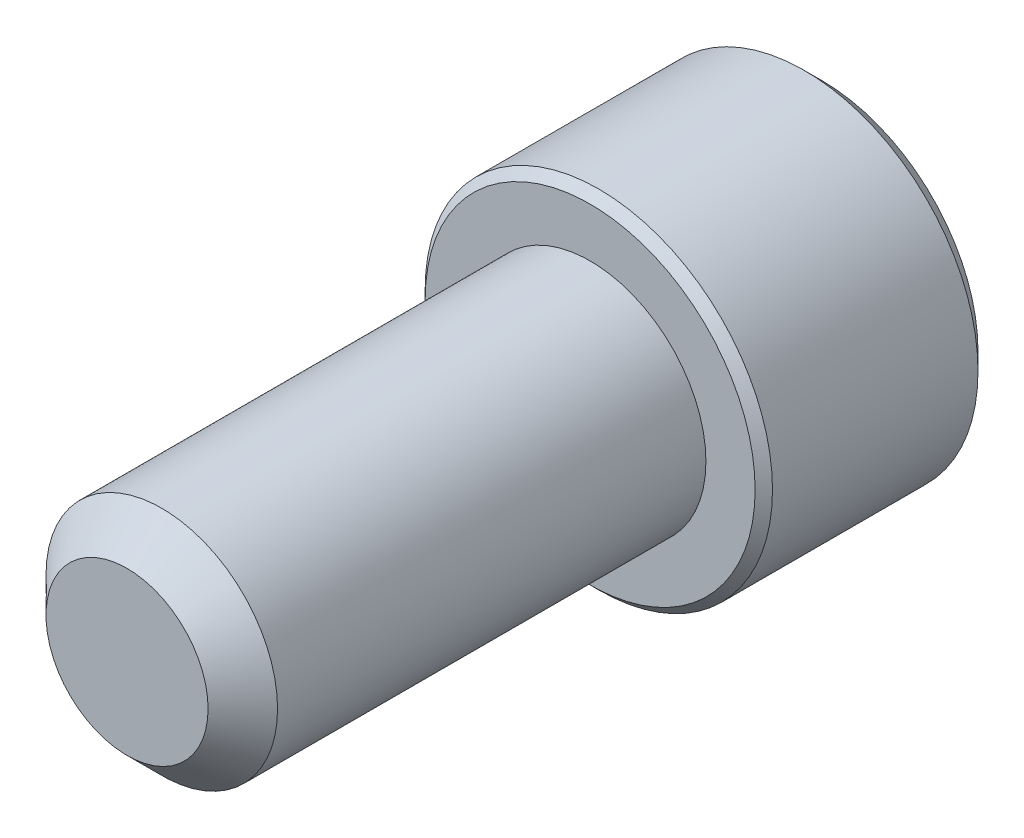
ISO-10303-21;
HEADER;
FILE_DESCRIPTION(('STEP AP214'),'2;1');
FILE_NAME('part.step','',(''),(''),'','','');
FILE_SCHEMA(('AUTOMOTIVE_DESIGN { 1 0 10303 214 1 1 1 1 }'));
ENDSEC;
DATA;
#1=APPLICATION_CONTEXT('core data for automotive mechanical design processes');
#2=APPLICATION_PROTOCOL_DEFINITION('international standard','automotive_design',2000,#1);
#3=PRODUCT_CONTEXT('',#1,'mechanical');
#4=PRODUCT('Part','Part','',(#3));
#5=PRODUCT_RELATED_PRODUCT_CATEGORY('part','',(#4));
#6=PRODUCT_DEFINITION_FORMATION('','',#4);
#7=PRODUCT_DEFINITION_CONTEXT('part definition',#1,'design');
#8=PRODUCT_DEFINITION('design','',#6,#7);
#9=PRODUCT_DEFINITION_SHAPE('','',#8);
#10=(LENGTH_UNIT() NAMED_UNIT(*) SI_UNIT(.MILLI.,.METRE.));
#11=(NAMED_UNIT(*) PLANE_ANGLE_UNIT() SI_UNIT($,.RADIAN.));
#12=(NAMED_UNIT(*) SI_UNIT($,.STERADIAN.) SOLID_ANGLE_UNIT());
#13=UNCERTAINTY_MEASURE_WITH_UNIT(LENGTH_MEASURE(1.E-05),#10,'distance_accuracy_value','');
#14=(GEOMETRIC_REPRESENTATION_CONTEXT(3) GLOBAL_UNCERTAINTY_ASSIGNED_CONTEXT((#13)) GLOBAL_UNIT_ASSIGNED_CONTEXT((#10,
#11,#12)) REPRESENTATION_CONTEXT('',''));
#15=CARTESIAN_POINT('',(0.,0.,0.));
#16=DIRECTION('',(0.,0.,1.));
#17=DIRECTION('',(1.,0.,0.));
#18=AXIS2_PLACEMENT_3D('',#15,#16,#17);
#19=CARTESIAN_POINT('',(0.,0.,-12.7));
#20=DIRECTION('',(0.,0.,1.));
#21=DIRECTION('',(1.,0.,0.));
#22=AXIS2_PLACEMENT_3D('',#19,#20,#21);
#23=CYLINDRICAL_SURFACE('',#22,3.175);
#24=CARTESIAN_POINT('',(0.,0.,-0.952500000000004));
#25=DIRECTION('',(0.,0.,1.));
#26=DIRECTION('',(1.,0.,0.));
#27=AXIS2_PLACEMENT_3D('',#24,#25,#26);
#28=CIRCLE('',#27,3.175);
#29=CARTESIAN_POINT('',(3.175,0.,-0.952500000000004));
#30=VERTEX_POINT('',#29);
#31=EDGE_CURVE('E161',#30,#30,#28,.F.);
#32=ORIENTED_EDGE('',*,*,#31,.T.);
#33=EDGE_LOOP('',(#32));
#34=FACE_BOUND('',#33,.T.);
#35=CARTESIAN_POINT('',(0.,0.,-12.7));
#36=DIRECTION('',(0.,0.,-1.));
#37=DIRECTION('',(-1.,0.,0.));
#38=AXIS2_PLACEMENT_3D('',#35,#36,#37);
#39=CIRCLE('',#38,3.175);
#40=CARTESIAN_POINT('',(-3.175,0.,-12.7));
#41=VERTEX_POINT('',#40);
#42=EDGE_CURVE('E150',#41,#41,#39,.F.);
#43=ORIENTED_EDGE('',*,*,#42,.T.);
#44=EDGE_LOOP('',(#43));
#45=FACE_BOUND('',#44,.T.);
#46=ADVANCED_FACE('F48',(#34,#45),#23,.T.);
#47=CARTESIAN_POINT('',(0.,0.,0.));
#48=DIRECTION('',(0.,0.,1.));
#49=DIRECTION('',(1.,0.,0.));
#50=AXIS2_PLACEMENT_3D('',#47,#48,#49);
#51=PLANE('',#50);
#52=CARTESIAN_POINT('',(0.,0.,0.));
#53=DIRECTION('',(0.,0.,1.));
#54=DIRECTION('',(1.,0.,0.));
#55=AXIS2_PLACEMENT_3D('',#52,#53,#54);
#56=CIRCLE('',#55,2.2225);
#57=CARTESIAN_POINT('',(2.2225,0.,0.));
#58=VERTEX_POINT('',#57);
#59=EDGE_CURVE('E158',#58,#58,#56,.T.);
#60=ORIENTED_EDGE('',*,*,#59,.T.);
#61=EDGE_LOOP('',(#60));
#62=FACE_BOUND('',#61,.T.);
#63=ADVANCED_FACE('F184',(#62),#51,.T.);
#64=CARTESIAN_POINT('',(0.,0.,0.));
#65=DIRECTION('',(0.,0.,-1.));
#66=DIRECTION('',(-1.,0.,0.));
#67=AXIS2_PLACEMENT_3D('',#64,#65,#66);
#68=CONICAL_SURFACE('',#67,2.2225,0.785398163397447);
#69=ORIENTED_EDGE('',*,*,#31,.F.);
#70=EDGE_LOOP('',(#69));
#71=FACE_BOUND('',#70,.T.);
#72=ORIENTED_EDGE('',*,*,#59,.F.);
#73=EDGE_LOOP('',(#72));
#74=FACE_BOUND('',#73,.T.);
#75=ADVANCED_FACE('F190',(#71,#74),#68,.T.);
#76=CARTESIAN_POINT('',(0.,0.,-19.05));
#77=DIRECTION('',(0.,0.,1.));
#78=DIRECTION('',(1.,0.,0.));
#79=AXIS2_PLACEMENT_3D('',#76,#77,#78);
#80=CYLINDRICAL_SURFACE('',#79,4.7625);
#81=CARTESIAN_POINT('',(0.,0.,-12.938125));
#82=DIRECTION('',(0.,0.,-1.));
#83=DIRECTION('',(-1.,0.,0.));
#84=AXIS2_PLACEMENT_3D('',#81,#82,#83);
#85=CIRCLE('',#84,4.7625);
#86=CARTESIAN_POINT('',(-4.7625,0.,-12.938125));
#87=VERTEX_POINT('',#86);
#88=EDGE_CURVE('E56',#87,#87,#85,.T.);
#89=ORIENTED_EDGE('',*,*,#88,.T.);
#90=EDGE_LOOP('',(#89));
#91=FACE_BOUND('',#90,.T.);
#92=CARTESIAN_POINT('',(0.,0.,-18.57375));
#93=DIRECTION('',(0.,0.,-1.));
#94=DIRECTION('',(-1.,0.,0.));
#95=AXIS2_PLACEMENT_3D('',#92,#93,#94);
#96=CIRCLE('',#95,4.7625);
#97=CARTESIAN_POINT('',(4.7625,0.,-18.57375));
#98=VERTEX_POINT('',#97);
#99=EDGE_CURVE('E167',#98,#98,#96,.F.);
#100=ORIENTED_EDGE('',*,*,#99,.T.);
#101=EDGE_LOOP('',(#100));
#102=FACE_BOUND('',#101,.T.);
#103=ADVANCED_FACE('F172',(#91,#102),#80,.T.);
#104=CARTESIAN_POINT('',(0.,0.,-19.05));
#105=DIRECTION('',(0.,0.,-1.));
#106=DIRECTION('',(-1.,0.,0.));
#107=AXIS2_PLACEMENT_3D('',#104,#105,#106);
#108=PLANE('',#107);
#109=CARTESIAN_POINT('',(0.,0.,-19.05));
#110=DIRECTION('',(0.,0.,-1.));
#111=DIRECTION('',(-1.,0.,0.));
#112=AXIS2_PLACEMENT_3D('',#109,#110,#111);
#113=CIRCLE('',#112,4.28625);
#114=CARTESIAN_POINT('',(4.28625,0.,-19.05));
#115=VERTEX_POINT('',#114);
#116=EDGE_CURVE('E164',#115,#115,#113,.T.);
#117=ORIENTED_EDGE('',*,*,#116,.T.);
#118=EDGE_LOOP('',(#117));
#119=FACE_BOUND('',#118,.T.);
#120=DIRECTION('',(0.866025403784439,0.5,0.));
#121=VECTOR('',#120,1.);
#122=CARTESIAN_POINT('',(-2.38125,1.3748153285078,-19.05));
#123=LINE('',#122,#121);
#124=CARTESIAN_POINT('',(-2.38125,1.3748153285078,-19.05));
#125=VERTEX_POINT('',#124);
#126=CARTESIAN_POINT('',(0.,2.74963065701559,-19.05));
#127=VERTEX_POINT('',#126);
#128=EDGE_CURVE('E63',#125,#127,#123,.T.);
#129=ORIENTED_EDGE('',*,*,#128,.F.);
#130=DIRECTION('',(0.,1.,0.));
#131=VECTOR('',#130,1.);
#132=CARTESIAN_POINT('',(-2.38125,-1.3748153285078,-19.05));
#133=LINE('',#132,#131);
#134=CARTESIAN_POINT('',(-2.38125,-1.3748153285078,-19.05));
#135=VERTEX_POINT('',#134);
#136=EDGE_CURVE('E146',#135,#125,#133,.T.);
#137=ORIENTED_EDGE('',*,*,#136,.F.);
#138=DIRECTION('',(-0.866025403784439,0.5,0.));
#139=VECTOR('',#138,1.);
#140=CARTESIAN_POINT('',(0.,-2.74963065701559,-19.05));
#141=LINE('',#140,#139);
#142=CARTESIAN_POINT('',(0.,-2.74963065701559,-19.05));
#143=VERTEX_POINT('',#142);
#144=EDGE_CURVE('E144',#143,#135,#141,.T.);
#145=ORIENTED_EDGE('',*,*,#144,.F.);
#146=DIRECTION('',(-0.866025403784439,-0.5,0.));
#147=VECTOR('',#146,1.);
#148=CARTESIAN_POINT('',(2.38125,-1.3748153285078,-19.05));
#149=LINE('',#148,#147);
#150=CARTESIAN_POINT('',(2.38125,-1.3748153285078,-19.05));
#151=VERTEX_POINT('',#150);
#152=EDGE_CURVE('E111',#151,#143,#149,.T.);
#153=ORIENTED_EDGE('',*,*,#152,.F.);
#154=DIRECTION('',(0.,-1.,0.));
#155=VECTOR('',#154,1.);
#156=CARTESIAN_POINT('',(2.38125,1.3748153285078,-19.05));
#157=LINE('',#156,#155);
#158=CARTESIAN_POINT('',(2.38125,1.3748153285078,-19.05));
#159=VERTEX_POINT('',#158);
#160=EDGE_CURVE('E140',#159,#151,#157,.T.);
#161=ORIENTED_EDGE('',*,*,#160,.F.);
#162=DIRECTION('',(0.866025403784439,-0.5,0.));
#163=VECTOR('',#162,1.);
#164=CARTESIAN_POINT('',(0.,2.74963065701559,-19.05));
#165=LINE('',#164,#163);
#166=EDGE_CURVE('E137',#127,#159,#165,.T.);
#167=ORIENTED_EDGE('',*,*,#166,.F.);
#168=EDGE_LOOP('',(#129,#137,#145,#153,#161,#167));
#169=FACE_BOUND('',#168,.T.);
#170=ADVANCED_FACE('F201',(#119,#169),#108,.T.);
#171=CARTESIAN_POINT('',(0.,0.,-12.7));
#172=DIRECTION('',(0.,0.,-1.));
#173=DIRECTION('',(-1.,0.,0.));
#174=AXIS2_PLACEMENT_3D('',#171,#172,#173);
#175=PLANE('',#174);
#176=CARTESIAN_POINT('',(0.,0.,-12.7));
#177=DIRECTION('',(0.,0.,-1.));
#178=DIRECTION('',(-1.,0.,0.));
#179=AXIS2_PLACEMENT_3D('',#176,#177,#178);
#180=CIRCLE('',#179,4.524375);
#181=CARTESIAN_POINT('',(-4.524375,0.,-12.7));
#182=VERTEX_POINT('',#181);
#183=EDGE_CURVE('E13',#182,#182,#180,.F.);
#184=ORIENTED_EDGE('',*,*,#183,.T.);
#185=EDGE_LOOP('',(#184));
#186=FACE_BOUND('',#185,.T.);
#187=ORIENTED_EDGE('',*,*,#42,.F.);
#188=EDGE_LOOP('',(#187));
#189=FACE_BOUND('',#188,.T.);
#190=ADVANCED_FACE('F208',(#186,#189),#175,.F.);
#191=CARTESIAN_POINT('',(-2.38125,1.3748153285078,-15.478125));
#192=DIRECTION('',(-0.5,0.866025403784439,0.));
#193=DIRECTION('',(-0.866025403784439,-0.5,0.));
#194=AXIS2_PLACEMENT_3D('',#191,#192,#193);
#195=PLANE('',#194);
#196=ORIENTED_EDGE('',*,*,#128,.T.);
#197=DIRECTION('',(0.,0.,-1.));
#198=VECTOR('',#197,1.);
#199=CARTESIAN_POINT('',(0.,2.74963065701559,-15.478125));
#200=LINE('',#199,#198);
#201=CARTESIAN_POINT('',(0.,2.74963065701559,-15.478125));
#202=VERTEX_POINT('',#201);
#203=EDGE_CURVE('E93',#202,#127,#200,.T.);
#204=ORIENTED_EDGE('',*,*,#203,.F.);
#205=DIRECTION('',(0.866025403784439,0.5,0.));
#206=VECTOR('',#205,1.);
#207=CARTESIAN_POINT('',(-2.38125,1.3748153285078,-15.478125));
#208=LINE('',#207,#206);
#209=CARTESIAN_POINT('',(-2.38125,1.3748153285078,-15.478125));
#210=VERTEX_POINT('',#209);
#211=EDGE_CURVE('E148',#210,#202,#208,.T.);
#212=ORIENTED_EDGE('',*,*,#211,.F.);
#213=DIRECTION('',(0.,0.,-1.));
#214=VECTOR('',#213,1.);
#215=CARTESIAN_POINT('',(-2.38125,1.3748153285078,-15.478125));
#216=LINE('',#215,#214);
#217=EDGE_CURVE('E71',#210,#125,#216,.T.);
#218=ORIENTED_EDGE('',*,*,#217,.T.);
#219=EDGE_LOOP('',(#196,#204,#212,#218));
#220=FACE_BOUND('',#219,.T.);
#221=ADVANCED_FACE('F213',(#220),#195,.F.);
#222=CARTESIAN_POINT('',(-2.38125,-1.3748153285078,-15.478125));
#223=DIRECTION('',(-1.,0.,0.));
#224=DIRECTION('',(0.,-1.,0.));
#225=AXIS2_PLACEMENT_3D('',#222,#223,#224);
#226=PLANE('',#225);
#227=ORIENTED_EDGE('',*,*,#136,.T.);
#228=ORIENTED_EDGE('',*,*,#217,.F.);
#229=DIRECTION('',(0.,1.,0.));
#230=VECTOR('',#229,1.);
#231=CARTESIAN_POINT('',(-2.38125,-1.3748153285078,-15.478125));
#232=LINE('',#231,#230);
#233=CARTESIAN_POINT('',(-2.38125,-1.3748153285078,-15.478125));
#234=VERTEX_POINT('',#233);
#235=EDGE_CURVE('E123',#234,#210,#232,.T.);
#236=ORIENTED_EDGE('',*,*,#235,.F.);
#237=DIRECTION('',(0.,0.,-1.));
#238=VECTOR('',#237,1.);
#239=CARTESIAN_POINT('',(-2.38125,-1.3748153285078,-15.478125));
#240=LINE('',#239,#238);
#241=EDGE_CURVE('E115',#234,#135,#240,.T.);
#242=ORIENTED_EDGE('',*,*,#241,.T.);
#243=EDGE_LOOP('',(#227,#228,#236,#242));
#244=FACE_BOUND('',#243,.T.);
#245=ADVANCED_FACE('F218',(#244),#226,.F.);
#246=CARTESIAN_POINT('',(0.,-2.74963065701559,-15.478125));
#247=DIRECTION('',(-0.5,-0.866025403784439,0.));
#248=DIRECTION('',(0.866025403784439,-0.5,0.));
#249=AXIS2_PLACEMENT_3D('',#246,#247,#248);
#250=PLANE('',#249);
#251=ORIENTED_EDGE('',*,*,#144,.T.);
#252=ORIENTED_EDGE('',*,*,#241,.F.);
#253=DIRECTION('',(-0.866025403784439,0.5,0.));
#254=VECTOR('',#253,1.);
#255=CARTESIAN_POINT('',(0.,-2.74963065701559,-15.478125));
#256=LINE('',#255,#254);
#257=CARTESIAN_POINT('',(0.,-2.74963065701559,-15.478125));
#258=VERTEX_POINT('',#257);
#259=EDGE_CURVE('E119',#258,#234,#256,.T.);
#260=ORIENTED_EDGE('',*,*,#259,.F.);
#261=DIRECTION('',(0.,0.,-1.));
#262=VECTOR('',#261,1.);
#263=CARTESIAN_POINT('',(0.,-2.74963065701559,-15.478125));
#264=LINE('',#263,#262);
#265=EDGE_CURVE('E104',#258,#143,#264,.T.);
#266=ORIENTED_EDGE('',*,*,#265,.T.);
#267=EDGE_LOOP('',(#251,#252,#260,#266));
#268=FACE_BOUND('',#267,.T.);
#269=ADVANCED_FACE('F120',(#268),#250,.F.);
#270=CARTESIAN_POINT('',(2.38125,-1.3748153285078,-15.478125));
#271=DIRECTION('',(0.5,-0.866025403784439,0.));
#272=DIRECTION('',(0.866025403784439,0.5,0.));
#273=AXIS2_PLACEMENT_3D('',#270,#271,#272);
#274=PLANE('',#273);
#275=ORIENTED_EDGE('',*,*,#152,.T.);
#276=ORIENTED_EDGE('',*,*,#265,.F.);
#277=DIRECTION('',(-0.866025403784439,-0.5,0.));
#278=VECTOR('',#277,1.);
#279=CARTESIAN_POINT('',(2.38125,-1.3748153285078,-15.478125));
#280=LINE('',#279,#278);
#281=CARTESIAN_POINT('',(2.38125,-1.3748153285078,-15.478125));
#282=VERTEX_POINT('',#281);
#283=EDGE_CURVE('E108',#282,#258,#280,.T.);
#284=ORIENTED_EDGE('',*,*,#283,.F.);
#285=DIRECTION('',(0.,0.,-1.));
#286=VECTOR('',#285,1.);
#287=CARTESIAN_POINT('',(2.38125,-1.3748153285078,-15.478125));
#288=LINE('',#287,#286);
#289=EDGE_CURVE('E116',#282,#151,#288,.T.);
#290=ORIENTED_EDGE('',*,*,#289,.T.);
#291=EDGE_LOOP('',(#275,#276,#284,#290));
#292=FACE_BOUND('',#291,.T.);
#293=ADVANCED_FACE('F106',(#292),#274,.F.);
#294=CARTESIAN_POINT('',(2.38125,1.3748153285078,-15.478125));
#295=DIRECTION('',(1.,0.,0.));
#296=DIRECTION('',(0.,1.,0.));
#297=AXIS2_PLACEMENT_3D('',#294,#295,#296);
#298=PLANE('',#297);
#299=ORIENTED_EDGE('',*,*,#160,.T.);
#300=ORIENTED_EDGE('',*,*,#289,.F.);
#301=DIRECTION('',(0.,-1.,0.));
#302=VECTOR('',#301,1.);
#303=CARTESIAN_POINT('',(2.38125,1.3748153285078,-15.478125));
#304=LINE('',#303,#302);
#305=CARTESIAN_POINT('',(2.38125,1.3748153285078,-15.478125));
#306=VERTEX_POINT('',#305);
#307=EDGE_CURVE('E129',#306,#282,#304,.T.);
#308=ORIENTED_EDGE('',*,*,#307,.F.);
#309=DIRECTION('',(0.,0.,-1.));
#310=VECTOR('',#309,1.);
#311=CARTESIAN_POINT('',(2.38125,1.3748153285078,-15.478125));
#312=LINE('',#311,#310);
#313=EDGE_CURVE('E153',#306,#159,#312,.T.);
#314=ORIENTED_EDGE('',*,*,#313,.T.);
#315=EDGE_LOOP('',(#299,#300,#308,#314));
#316=FACE_BOUND('',#315,.T.);
#317=ADVANCED_FACE('F222',(#316),#298,.F.);
#318=CARTESIAN_POINT('',(0.,2.74963065701559,-15.478125));
#319=DIRECTION('',(0.5,0.866025403784439,0.));
#320=DIRECTION('',(-0.866025403784439,0.5,0.));
#321=AXIS2_PLACEMENT_3D('',#318,#319,#320);
#322=PLANE('',#321);
#323=ORIENTED_EDGE('',*,*,#166,.T.);
#324=ORIENTED_EDGE('',*,*,#313,.F.);
#325=DIRECTION('',(0.866025403784439,-0.5,0.));
#326=VECTOR('',#325,1.);
#327=CARTESIAN_POINT('',(0.,2.74963065701559,-15.478125));
#328=LINE('',#327,#326);
#329=EDGE_CURVE('E131',#202,#306,#328,.T.);
#330=ORIENTED_EDGE('',*,*,#329,.F.);
#331=ORIENTED_EDGE('',*,*,#203,.T.);
#332=EDGE_LOOP('',(#323,#324,#330,#331));
#333=FACE_BOUND('',#332,.T.);
#334=ADVANCED_FACE('F219',(#333),#322,.F.);
#335=CARTESIAN_POINT('',(2.38125,4.12444598552339,-15.478125));
#336=DIRECTION('',(0.,0.,-1.));
#337=DIRECTION('',(-1.,0.,0.));
#338=AXIS2_PLACEMENT_3D('',#335,#336,#337);
#339=PLANE('',#338);
#340=ORIENTED_EDGE('',*,*,#211,.T.);
#341=ORIENTED_EDGE('',*,*,#329,.T.);
#342=ORIENTED_EDGE('',*,*,#307,.T.);
#343=ORIENTED_EDGE('',*,*,#283,.T.);
#344=ORIENTED_EDGE('',*,*,#259,.T.);
#345=ORIENTED_EDGE('',*,*,#235,.T.);
#346=EDGE_LOOP('',(#340,#341,#342,#343,#344,#345));
#347=FACE_BOUND('',#346,.T.);
#348=ADVANCED_FACE('F126',(#347),#339,.T.);
#349=CARTESIAN_POINT('',(0.,0.,-19.05));
#350=DIRECTION('',(0.,0.,1.));
#351=DIRECTION('',(1.,0.,0.));
#352=AXIS2_PLACEMENT_3D('',#349,#350,#351);
#353=CONICAL_SURFACE('',#352,4.28625,0.785398163397446);
#354=CARTESIAN_POINT('',(4.7625,0.,-18.57375));
#355=CARTESIAN_POINT('',(4.7575390625,0.,-18.5787109375));
#356=CARTESIAN_POINT('',(4.752578125,0.,-18.583671875));
#357=CARTESIAN_POINT('',(4.74265625,0.,-18.59359375));
#358=CARTESIAN_POINT('',(4.7376953125,0.,-18.5985546875));
#359=CARTESIAN_POINT('',(4.7277734375,0.,-18.6084765625));
#360=CARTESIAN_POINT('',(4.7228125,0.,-18.6134375));
#361=CARTESIAN_POINT('',(4.712890625,0.,-18.623359375));
#362=CARTESIAN_POINT('',(4.7079296875,0.,-18.6283203125));
#363=CARTESIAN_POINT('',(4.6980078125,0.,-18.6382421875));
#364=CARTESIAN_POINT('',(4.693046875,0.,-18.643203125));
#365=CARTESIAN_POINT('',(4.683125,0.,-18.653125));
#366=CARTESIAN_POINT('',(4.6781640625,0.,-18.6580859375));
#367=CARTESIAN_POINT('',(4.6682421875,0.,-18.6680078125));
#368=CARTESIAN_POINT('',(4.66328125,0.,-18.67296875));
#369=CARTESIAN_POINT('',(4.653359375,0.,-18.682890625));
#370=CARTESIAN_POINT('',(4.6483984375,0.,-18.6878515625));
#371=CARTESIAN_POINT('',(4.6384765625,0.,-18.6977734375));
#372=CARTESIAN_POINT('',(4.633515625,0.,-18.702734375));
#373=CARTESIAN_POINT('',(4.62359375,0.,-18.71265625));
#374=CARTESIAN_POINT('',(4.6186328125,0.,-18.7176171875));
#375=CARTESIAN_POINT('',(4.6087109375,0.,-18.7275390625));
#376=CARTESIAN_POINT('',(4.60375,0.,-18.7325));
#377=CARTESIAN_POINT('',(4.593828125,0.,-18.742421875));
#378=CARTESIAN_POINT('',(4.5888671875,0.,-18.7473828125));
#379=CARTESIAN_POINT('',(4.5789453125,0.,-18.7573046875));
#380=CARTESIAN_POINT('',(4.573984375,0.,-18.762265625));
#381=CARTESIAN_POINT('',(4.5640625,0.,-18.7721875));
#382=CARTESIAN_POINT('',(4.5591015625,0.,-18.7771484375));
#383=CARTESIAN_POINT('',(4.5491796875,0.,-18.7870703125));
#384=CARTESIAN_POINT('',(4.54421875,0.,-18.79203125));
#385=CARTESIAN_POINT('',(4.534296875,0.,-18.801953125));
#386=CARTESIAN_POINT('',(4.5293359375,0.,-18.8069140625));
#387=CARTESIAN_POINT('',(4.5194140625,0.,-18.8168359375));
#388=CARTESIAN_POINT('',(4.514453125,0.,-18.821796875));
#389=CARTESIAN_POINT('',(4.50453125,0.,-18.83171875));
#390=CARTESIAN_POINT('',(4.4995703125,0.,-18.8366796875));
#391=CARTESIAN_POINT('',(4.4896484375,0.,-18.8466015625));
#392=CARTESIAN_POINT('',(4.4846875,0.,-18.8515625));
#393=CARTESIAN_POINT('',(4.474765625,0.,-18.861484375));
#394=CARTESIAN_POINT('',(4.4698046875,0.,-18.8664453125));
#395=CARTESIAN_POINT('',(4.4598828125,0.,-18.8763671875));
#396=CARTESIAN_POINT('',(4.454921875,0.,-18.881328125));
#397=CARTESIAN_POINT('',(4.445,0.,-18.89125));
#398=CARTESIAN_POINT('',(4.4400390625,0.,-18.8962109375));
#399=CARTESIAN_POINT('',(4.4301171875,0.,-18.9061328125));
#400=CARTESIAN_POINT('',(4.42515625,0.,-18.91109375));
#401=CARTESIAN_POINT('',(4.415234375,0.,-18.921015625));
#402=CARTESIAN_POINT('',(4.4102734375,0.,-18.9259765625));
#403=CARTESIAN_POINT('',(4.4003515625,0.,-18.9358984375));
#404=CARTESIAN_POINT('',(4.395390625,0.,-18.940859375));
#405=CARTESIAN_POINT('',(4.38546875,0.,-18.95078125));
#406=CARTESIAN_POINT('',(4.3805078125,0.,-18.9557421875));
#407=CARTESIAN_POINT('',(4.3705859375,0.,-18.9656640625));
#408=CARTESIAN_POINT('',(4.365625,0.,-18.970625));
#409=CARTESIAN_POINT('',(4.355703125,0.,-18.980546875));
#410=CARTESIAN_POINT('',(4.3507421875,0.,-18.9855078125));
#411=CARTESIAN_POINT('',(4.3408203125,0.,-18.9954296875));
#412=CARTESIAN_POINT('',(4.335859375,0.,-19.000390625));
#413=CARTESIAN_POINT('',(4.3259375,0.,-19.0103125));
#414=CARTESIAN_POINT('',(4.3209765625,0.,-19.0152734375));
#415=CARTESIAN_POINT('',(4.3110546875,0.,-19.0251953125));
#416=CARTESIAN_POINT('',(4.30609375,0.,-19.03015625));
#417=CARTESIAN_POINT('',(4.296171875,0.,-19.040078125));
#418=CARTESIAN_POINT('',(4.2912109375,0.,-19.0450390625));
#419=CARTESIAN_POINT('',(4.28625,0.,-19.05));
#420=B_SPLINE_CURVE_WITH_KNOTS('',3,(#354,#355,#356,#357,#358,#359,#360,#361,#362,#363,#364,
#365,#366,#367,#368,#369,#370,#371,#372,#373,#374,#375,#376,#377,#378,#379,#380,#381,#382,#383,
#384,#385,#386,#387,#388,#389,#390,#391,#392,#393,#394,#395,#396,#397,#398,#399,#400,#401,#402,
#403,#404,#405,#406,#407,#408,#409,#410,#411,#412,#413,#414,#415,#416,#417,#418,#419),
.UNSPECIFIED.,.F.,.F.,(4,2,2,2,2,2,2,2,2,2,2,2,2,2,2,2,2,2,2,2,2,2,2,2,2,2,2,2,2,2,2,2,4),(0.,
0.0210474752837545,0.0420949505675096,0.0631424258512672,0.0841899011350217,0.105237376418779,
0.126284851702534,0.147332326986289,0.168379802270046,0.189427277553801,0.210474752837558,
0.231522228121313,0.252569703405067,0.273617178688825,0.294664653972579,0.315712129256337,
0.336759604540092,0.357807079823847,0.378854555107604,0.399902030391359,0.420949505675116,
0.441996980958871,0.463044456242626,0.484091931526383,0.505139406810138,0.526186882093895,
0.54723435737765,0.568281832661404,0.589329307945162,0.610376783228916,0.631424258512674,
0.652471733796428,0.673519209080186),.UNSPECIFIED.);
#421=EDGE_CURVE('BSEAM176',#98,#115,#420,.T.);
#422=ORIENTED_EDGE('',*,*,#99,.F.);
#423=ORIENTED_EDGE('',*,*,#116,.F.);
#424=ORIENTED_EDGE('',*,*,#421,.T.);
#425=ORIENTED_EDGE('',*,*,#421,.F.);
#426=EDGE_LOOP('',(#422,#424,#423,#425));
#427=FACE_BOUND('',#426,.T.);
#428=ADVANCED_FACE('F176',(#427),#353,.T.);
#429=CARTESIAN_POINT('',(0.,0.,-12.938125));
#430=DIRECTION('',(0.,0.,-1.));
#431=DIRECTION('',(-1.,0.,0.));
#432=AXIS2_PLACEMENT_3D('',#429,#430,#431);
#433=CONICAL_SURFACE('',#432,4.7625,0.785398163397447);
#434=ORIENTED_EDGE('',*,*,#183,.F.);
#435=EDGE_LOOP('',(#434));
#436=FACE_BOUND('',#435,.T.);
#437=ORIENTED_EDGE('',*,*,#88,.F.);
#438=EDGE_LOOP('',(#437));
#439=FACE_BOUND('',#438,.T.);
#440=ADVANCED_FACE('F50',(#436,#439),#433,.T.);
#441=CLOSED_SHELL('',(#46,#63,#75,#103,#170,#190,#221,#245,#269,#293,#317,#334,#348,#428,#440));
#442=MANIFOLD_SOLID_BREP('B2',#441);
#443=ADVANCED_BREP_SHAPE_REPRESENTATION('',(#18,#442),#14);
#444=SHAPE_DEFINITION_REPRESENTATION(#9,#443);
ENDSEC;
END-ISO-10303-21;
